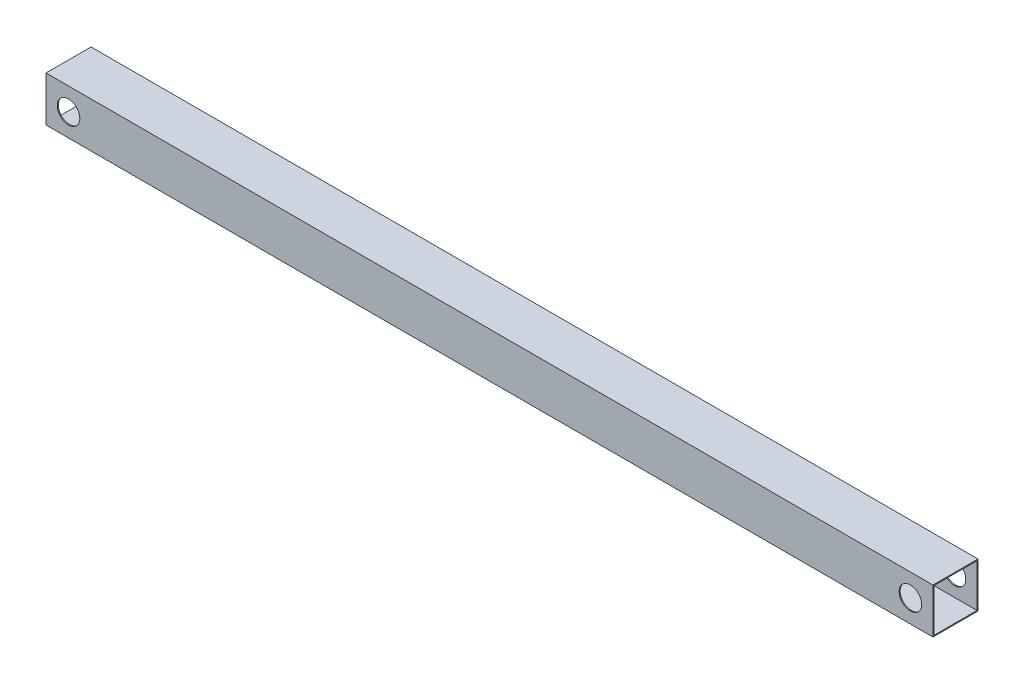
ISO-10303-21;
HEADER;
FILE_DESCRIPTION(('STEP AP214'),'2;1');
FILE_NAME('part.step','',(''),(''),'','','');
FILE_SCHEMA(('AUTOMOTIVE_DESIGN { 1 0 10303 214 1 1 1 1 }'));
ENDSEC;
DATA;
#1=APPLICATION_CONTEXT('core data for automotive mechanical design processes');
#2=APPLICATION_PROTOCOL_DEFINITION('international standard','automotive_design',2000,#1);
#3=PRODUCT_CONTEXT('',#1,'mechanical');
#4=PRODUCT('Part','Part','',(#3));
#5=PRODUCT_RELATED_PRODUCT_CATEGORY('part','',(#4));
#6=PRODUCT_DEFINITION_FORMATION('','',#4);
#7=PRODUCT_DEFINITION_CONTEXT('part definition',#1,'design');
#8=PRODUCT_DEFINITION('design','',#6,#7);
#9=PRODUCT_DEFINITION_SHAPE('','',#8);
#10=(LENGTH_UNIT() NAMED_UNIT(*) SI_UNIT(.MILLI.,.METRE.));
#11=(NAMED_UNIT(*) PLANE_ANGLE_UNIT() SI_UNIT($,.RADIAN.));
#12=(NAMED_UNIT(*) SI_UNIT($,.STERADIAN.) SOLID_ANGLE_UNIT());
#13=UNCERTAINTY_MEASURE_WITH_UNIT(LENGTH_MEASURE(1.E-05),#10,'distance_accuracy_value','');
#14=(GEOMETRIC_REPRESENTATION_CONTEXT(3) GLOBAL_UNCERTAINTY_ASSIGNED_CONTEXT((#13)) GLOBAL_UNIT_ASSIGNED_CONTEXT((#10,
#11,#12)) REPRESENTATION_CONTEXT('',''));
#15=CARTESIAN_POINT('',(0.,0.,0.));
#16=DIRECTION('',(0.,0.,1.));
#17=DIRECTION('',(1.,0.,0.));
#18=AXIS2_PLACEMENT_3D('',#15,#16,#17);
#19=CARTESIAN_POINT('',(500.,12.7,12.7));
#20=DIRECTION('',(0.,-1.,0.));
#21=DIRECTION('',(0.,0.,-1.));
#22=AXIS2_PLACEMENT_3D('',#19,#20,#21);
#23=PLANE('',#22);
#24=DIRECTION('',(0.,0.,1.));
#25=VECTOR('',#24,1.);
#26=CARTESIAN_POINT('',(0.,12.7,12.7));
#27=LINE('',#26,#25);
#28=CARTESIAN_POINT('',(0.,12.7,-12.7));
#29=VERTEX_POINT('',#28);
#30=CARTESIAN_POINT('',(0.,12.7,12.7));
#31=VERTEX_POINT('',#30);
#32=EDGE_CURVE('E159',#29,#31,#27,.T.);
#33=ORIENTED_EDGE('',*,*,#32,.T.);
#34=DIRECTION('',(-1.,0.,0.));
#35=VECTOR('',#34,1.);
#36=CARTESIAN_POINT('',(500.,12.7,12.7));
#37=LINE('',#36,#35);
#38=CARTESIAN_POINT('',(500.,12.7,12.7));
#39=VERTEX_POINT('',#38);
#40=EDGE_CURVE('E12',#39,#31,#37,.T.);
#41=ORIENTED_EDGE('',*,*,#40,.F.);
#42=DIRECTION('',(0.,0.,1.));
#43=VECTOR('',#42,1.);
#44=CARTESIAN_POINT('',(500.,12.7,12.7));
#45=LINE('',#44,#43);
#46=CARTESIAN_POINT('',(500.,12.7,-12.7));
#47=VERTEX_POINT('',#46);
#48=EDGE_CURVE('E132',#47,#39,#45,.T.);
#49=ORIENTED_EDGE('',*,*,#48,.F.);
#50=DIRECTION('',(-1.,0.,0.));
#51=VECTOR('',#50,1.);
#52=CARTESIAN_POINT('',(500.,12.7,-12.7));
#53=LINE('',#52,#51);
#54=EDGE_CURVE('E166',#47,#29,#53,.T.);
#55=ORIENTED_EDGE('',*,*,#54,.T.);
#56=EDGE_LOOP('',(#33,#41,#49,#55));
#57=FACE_BOUND('',#56,.T.);
#58=ADVANCED_FACE('F51',(#57),#23,.F.);
#59=CARTESIAN_POINT('',(500.,12.7,12.7));
#60=DIRECTION('',(0.,0.,-1.));
#61=DIRECTION('',(-1.,0.,0.));
#62=AXIS2_PLACEMENT_3D('',#59,#60,#61);
#63=PLANE('',#62);
#64=CARTESIAN_POINT('',(487.3,0.,12.7));
#65=DIRECTION('',(0.,0.,1.));
#66=DIRECTION('',(1.,0.,0.));
#67=AXIS2_PLACEMENT_3D('',#64,#65,#66);
#68=CIRCLE('',#67,6.34999999999982);
#69=CARTESIAN_POINT('',(493.65,0.,12.7));
#70=VERTEX_POINT('',#69);
#71=EDGE_CURVE('E217',#70,#70,#68,.T.);
#72=ORIENTED_EDGE('',*,*,#71,.F.);
#73=EDGE_LOOP('',(#72));
#74=FACE_BOUND('',#73,.T.);
#75=CARTESIAN_POINT('',(12.7,0.,12.7));
#76=DIRECTION('',(0.,0.,1.));
#77=DIRECTION('',(1.,0.,0.));
#78=AXIS2_PLACEMENT_3D('',#75,#76,#77);
#79=CIRCLE('',#78,6.35);
#80=CARTESIAN_POINT('',(19.05,0.,12.7));
#81=VERTEX_POINT('',#80);
#82=EDGE_CURVE('E205',#81,#81,#79,.T.);
#83=ORIENTED_EDGE('',*,*,#82,.F.);
#84=EDGE_LOOP('',(#83));
#85=FACE_BOUND('',#84,.T.);
#86=DIRECTION('',(0.,-1.,0.));
#87=VECTOR('',#86,1.);
#88=CARTESIAN_POINT('',(0.,12.7,12.7));
#89=LINE('',#88,#87);
#90=CARTESIAN_POINT('',(0.,-12.7,12.7));
#91=VERTEX_POINT('',#90);
#92=EDGE_CURVE('E137',#31,#91,#89,.T.);
#93=ORIENTED_EDGE('',*,*,#92,.T.);
#94=DIRECTION('',(-1.,0.,0.));
#95=VECTOR('',#94,1.);
#96=CARTESIAN_POINT('',(500.,-12.7,12.7));
#97=LINE('',#96,#95);
#98=CARTESIAN_POINT('',(500.,-12.7,12.7));
#99=VERTEX_POINT('',#98);
#100=EDGE_CURVE('E61',#99,#91,#97,.T.);
#101=ORIENTED_EDGE('',*,*,#100,.F.);
#102=DIRECTION('',(0.,-1.,0.));
#103=VECTOR('',#102,1.);
#104=CARTESIAN_POINT('',(500.,12.7,12.7));
#105=LINE('',#104,#103);
#106=EDGE_CURVE('E126',#39,#99,#105,.T.);
#107=ORIENTED_EDGE('',*,*,#106,.F.);
#108=ORIENTED_EDGE('',*,*,#40,.T.);
#109=EDGE_LOOP('',(#93,#101,#107,#108));
#110=FACE_BOUND('',#109,.T.);
#111=ADVANCED_FACE('F136',(#74,#85,#110),#63,.F.);
#112=CARTESIAN_POINT('',(500.,-12.7,-12.7));
#113=DIRECTION('',(0.,1.,0.));
#114=DIRECTION('',(0.,0.,1.));
#115=AXIS2_PLACEMENT_3D('',#112,#113,#114);
#116=PLANE('',#115);
#117=DIRECTION('',(0.,0.,-1.));
#118=VECTOR('',#117,1.);
#119=CARTESIAN_POINT('',(0.,-12.7,-12.7));
#120=LINE('',#119,#118);
#121=CARTESIAN_POINT('',(0.,-12.7,-12.7));
#122=VERTEX_POINT('',#121);
#123=EDGE_CURVE('E99',#91,#122,#120,.T.);
#124=ORIENTED_EDGE('',*,*,#123,.T.);
#125=DIRECTION('',(-1.,0.,0.));
#126=VECTOR('',#125,1.);
#127=CARTESIAN_POINT('',(500.,-12.7,-12.7));
#128=LINE('',#127,#126);
#129=CARTESIAN_POINT('',(500.,-12.7,-12.7));
#130=VERTEX_POINT('',#129);
#131=EDGE_CURVE('E138',#130,#122,#128,.T.);
#132=ORIENTED_EDGE('',*,*,#131,.F.);
#133=DIRECTION('',(0.,0.,-1.));
#134=VECTOR('',#133,1.);
#135=CARTESIAN_POINT('',(500.,-12.7,-12.7));
#136=LINE('',#135,#134);
#137=EDGE_CURVE('E130',#99,#130,#136,.T.);
#138=ORIENTED_EDGE('',*,*,#137,.F.);
#139=ORIENTED_EDGE('',*,*,#100,.T.);
#140=EDGE_LOOP('',(#124,#132,#138,#139));
#141=FACE_BOUND('',#140,.T.);
#142=ADVANCED_FACE('F140',(#141),#116,.F.);
#143=CARTESIAN_POINT('',(500.,12.1412,12.1412));
#144=DIRECTION('',(0.,0.,-1.));
#145=DIRECTION('',(-1.,0.,0.));
#146=AXIS2_PLACEMENT_3D('',#143,#144,#145);
#147=PLANE('',#146);
#148=CARTESIAN_POINT('',(487.3,0.,12.1412));
#149=DIRECTION('',(0.,0.,-1.));
#150=DIRECTION('',(-1.,0.,0.));
#151=AXIS2_PLACEMENT_3D('',#148,#149,#150);
#152=CIRCLE('',#151,6.34999999999982);
#153=CARTESIAN_POINT('',(480.95,0.,12.1412));
#154=VERTEX_POINT('',#153);
#155=EDGE_CURVE('E208',#154,#154,#152,.T.);
#156=ORIENTED_EDGE('',*,*,#155,.F.);
#157=EDGE_LOOP('',(#156));
#158=FACE_BOUND('',#157,.T.);
#159=CARTESIAN_POINT('',(12.7,0.,12.1412));
#160=DIRECTION('',(0.,0.,-1.));
#161=DIRECTION('',(-1.,0.,0.));
#162=AXIS2_PLACEMENT_3D('',#159,#160,#161);
#163=CIRCLE('',#162,6.35);
#164=CARTESIAN_POINT('',(6.35,0.,12.1412));
#165=VERTEX_POINT('',#164);
#166=EDGE_CURVE('E150',#165,#165,#163,.T.);
#167=ORIENTED_EDGE('',*,*,#166,.F.);
#168=EDGE_LOOP('',(#167));
#169=FACE_BOUND('',#168,.T.);
#170=DIRECTION('',(0.,-1.,0.));
#171=VECTOR('',#170,1.);
#172=CARTESIAN_POINT('',(0.,12.1412,12.1412));
#173=LINE('',#172,#171);
#174=CARTESIAN_POINT('',(0.,12.1412,12.1412));
#175=VERTEX_POINT('',#174);
#176=CARTESIAN_POINT('',(0.,-12.1412,12.1412));
#177=VERTEX_POINT('',#176);
#178=EDGE_CURVE('E146',#175,#177,#173,.T.);
#179=ORIENTED_EDGE('',*,*,#178,.F.);
#180=DIRECTION('',(-1.,0.,0.));
#181=VECTOR('',#180,1.);
#182=CARTESIAN_POINT('',(500.,12.1412,12.1412));
#183=LINE('',#182,#181);
#184=CARTESIAN_POINT('',(500.,12.1412,12.1412));
#185=VERTEX_POINT('',#184);
#186=EDGE_CURVE('E55',#185,#175,#183,.T.);
#187=ORIENTED_EDGE('',*,*,#186,.F.);
#188=DIRECTION('',(0.,-1.,0.));
#189=VECTOR('',#188,1.);
#190=CARTESIAN_POINT('',(500.,12.1412,12.1412));
#191=LINE('',#190,#189);
#192=CARTESIAN_POINT('',(500.,-12.1412,12.1412));
#193=VERTEX_POINT('',#192);
#194=EDGE_CURVE('E165',#185,#193,#191,.T.);
#195=ORIENTED_EDGE('',*,*,#194,.T.);
#196=DIRECTION('',(-1.,0.,0.));
#197=VECTOR('',#196,1.);
#198=CARTESIAN_POINT('',(500.,-12.1412,12.1412));
#199=LINE('',#198,#197);
#200=EDGE_CURVE('E142',#193,#177,#199,.T.);
#201=ORIENTED_EDGE('',*,*,#200,.T.);
#202=EDGE_LOOP('',(#179,#187,#195,#201));
#203=FACE_BOUND('',#202,.T.);
#204=ADVANCED_FACE('F53',(#158,#169,#203),#147,.T.);
#205=CARTESIAN_POINT('',(500.,12.1412,12.1412));
#206=DIRECTION('',(0.,-1.,0.));
#207=DIRECTION('',(0.,0.,-1.));
#208=AXIS2_PLACEMENT_3D('',#205,#206,#207);
#209=PLANE('',#208);
#210=DIRECTION('',(0.,0.,1.));
#211=VECTOR('',#210,1.);
#212=CARTESIAN_POINT('',(0.,12.1412,12.1412));
#213=LINE('',#212,#211);
#214=CARTESIAN_POINT('',(0.,12.1412,-12.1412));
#215=VERTEX_POINT('',#214);
#216=EDGE_CURVE('E149',#215,#175,#213,.T.);
#217=ORIENTED_EDGE('',*,*,#216,.F.);
#218=DIRECTION('',(-1.,0.,0.));
#219=VECTOR('',#218,1.);
#220=CARTESIAN_POINT('',(500.,12.1412,-12.1412));
#221=LINE('',#220,#219);
#222=CARTESIAN_POINT('',(500.,12.1412,-12.1412));
#223=VERTEX_POINT('',#222);
#224=EDGE_CURVE('E171',#223,#215,#221,.T.);
#225=ORIENTED_EDGE('',*,*,#224,.F.);
#226=DIRECTION('',(0.,0.,1.));
#227=VECTOR('',#226,1.);
#228=CARTESIAN_POINT('',(500.,12.1412,12.1412));
#229=LINE('',#228,#227);
#230=EDGE_CURVE('E180',#223,#185,#229,.T.);
#231=ORIENTED_EDGE('',*,*,#230,.T.);
#232=ORIENTED_EDGE('',*,*,#186,.T.);
#233=EDGE_LOOP('',(#217,#225,#231,#232));
#234=FACE_BOUND('',#233,.T.);
#235=ADVANCED_FACE('F178',(#234),#209,.T.);
#236=CARTESIAN_POINT('',(500.,-12.1412,-12.1412));
#237=DIRECTION('',(0.,0.,1.));
#238=DIRECTION('',(1.,0.,0.));
#239=AXIS2_PLACEMENT_3D('',#236,#237,#238);
#240=PLANE('',#239);
#241=CARTESIAN_POINT('',(487.3,0.,-12.1412));
#242=DIRECTION('',(0.,0.,1.));
#243=DIRECTION('',(1.,0.,0.));
#244=AXIS2_PLACEMENT_3D('',#241,#242,#243);
#245=CIRCLE('',#244,6.34999999999982);
#246=CARTESIAN_POINT('',(493.65,0.,-12.1412));
#247=VERTEX_POINT('',#246);
#248=EDGE_CURVE('E213',#247,#247,#245,.T.);
#249=ORIENTED_EDGE('',*,*,#248,.F.);
#250=EDGE_LOOP('',(#249));
#251=FACE_BOUND('',#250,.T.);
#252=CARTESIAN_POINT('',(12.7,0.,-12.1412));
#253=DIRECTION('',(0.,0.,1.));
#254=DIRECTION('',(1.,0.,0.));
#255=AXIS2_PLACEMENT_3D('',#252,#253,#254);
#256=CIRCLE('',#255,6.35);
#257=CARTESIAN_POINT('',(19.05,0.,-12.1412));
#258=VERTEX_POINT('',#257);
#259=EDGE_CURVE('E201',#258,#258,#256,.T.);
#260=ORIENTED_EDGE('',*,*,#259,.F.);
#261=EDGE_LOOP('',(#260));
#262=FACE_BOUND('',#261,.T.);
#263=DIRECTION('',(0.,1.,0.));
#264=VECTOR('',#263,1.);
#265=CARTESIAN_POINT('',(0.,-12.1412,-12.1412));
#266=LINE('',#265,#264);
#267=CARTESIAN_POINT('',(0.,-12.1412,-12.1412));
#268=VERTEX_POINT('',#267);
#269=EDGE_CURVE('E153',#268,#215,#266,.T.);
#270=ORIENTED_EDGE('',*,*,#269,.F.);
#271=DIRECTION('',(-1.,0.,0.));
#272=VECTOR('',#271,1.);
#273=CARTESIAN_POINT('',(500.,-12.1412,-12.1412));
#274=LINE('',#273,#272);
#275=CARTESIAN_POINT('',(500.,-12.1412,-12.1412));
#276=VERTEX_POINT('',#275);
#277=EDGE_CURVE('E170',#276,#268,#274,.T.);
#278=ORIENTED_EDGE('',*,*,#277,.F.);
#279=DIRECTION('',(0.,1.,0.));
#280=VECTOR('',#279,1.);
#281=CARTESIAN_POINT('',(500.,-12.1412,-12.1412));
#282=LINE('',#281,#280);
#283=EDGE_CURVE('E187',#276,#223,#282,.T.);
#284=ORIENTED_EDGE('',*,*,#283,.T.);
#285=ORIENTED_EDGE('',*,*,#224,.T.);
#286=EDGE_LOOP('',(#270,#278,#284,#285));
#287=FACE_BOUND('',#286,.T.);
#288=ADVANCED_FACE('F185',(#251,#262,#287),#240,.T.);
#289=CARTESIAN_POINT('',(500.,-12.1412,-12.1412));
#290=DIRECTION('',(0.,1.,0.));
#291=DIRECTION('',(0.,0.,1.));
#292=AXIS2_PLACEMENT_3D('',#289,#290,#291);
#293=PLANE('',#292);
#294=DIRECTION('',(0.,0.,-1.));
#295=VECTOR('',#294,1.);
#296=CARTESIAN_POINT('',(0.,-12.1412,-12.1412));
#297=LINE('',#296,#295);
#298=EDGE_CURVE('E156',#177,#268,#297,.T.);
#299=ORIENTED_EDGE('',*,*,#298,.F.);
#300=ORIENTED_EDGE('',*,*,#200,.F.);
#301=DIRECTION('',(0.,0.,-1.));
#302=VECTOR('',#301,1.);
#303=CARTESIAN_POINT('',(500.,-12.1412,-12.1412));
#304=LINE('',#303,#302);
#305=EDGE_CURVE('E192',#193,#276,#304,.T.);
#306=ORIENTED_EDGE('',*,*,#305,.T.);
#307=ORIENTED_EDGE('',*,*,#277,.T.);
#308=EDGE_LOOP('',(#299,#300,#306,#307));
#309=FACE_BOUND('',#308,.T.);
#310=ADVANCED_FACE('F194',(#309),#293,.T.);
#311=CARTESIAN_POINT('',(500.,-12.7,-12.7));
#312=DIRECTION('',(0.,0.,1.));
#313=DIRECTION('',(0.,-1.,0.));
#314=AXIS2_PLACEMENT_3D('',#311,#312,#313);
#315=PLANE('',#314);
#316=CARTESIAN_POINT('',(487.3,0.,-12.7));
#317=DIRECTION('',(0.,0.,1.));
#318=DIRECTION('',(1.,0.,0.));
#319=AXIS2_PLACEMENT_3D('',#316,#317,#318);
#320=CIRCLE('',#319,6.34999999999982);
#321=CARTESIAN_POINT('',(493.65,0.,-12.7));
#322=VERTEX_POINT('',#321);
#323=EDGE_CURVE('E216',#322,#322,#320,.T.);
#324=ORIENTED_EDGE('',*,*,#323,.T.);
#325=EDGE_LOOP('',(#324));
#326=FACE_BOUND('',#325,.T.);
#327=CARTESIAN_POINT('',(12.7,0.,-12.7));
#328=DIRECTION('',(0.,0.,1.));
#329=DIRECTION('',(1.,0.,0.));
#330=AXIS2_PLACEMENT_3D('',#327,#328,#329);
#331=CIRCLE('',#330,6.35);
#332=CARTESIAN_POINT('',(19.05,0.,-12.7));
#333=VERTEX_POINT('',#332);
#334=EDGE_CURVE('E204',#333,#333,#331,.T.);
#335=ORIENTED_EDGE('',*,*,#334,.T.);
#336=EDGE_LOOP('',(#335));
#337=FACE_BOUND('',#336,.T.);
#338=DIRECTION('',(0.,1.,0.));
#339=VECTOR('',#338,1.);
#340=CARTESIAN_POINT('',(0.,-12.7,-12.7));
#341=LINE('',#340,#339);
#342=EDGE_CURVE('E105',#122,#29,#341,.T.);
#343=ORIENTED_EDGE('',*,*,#342,.T.);
#344=ORIENTED_EDGE('',*,*,#54,.F.);
#345=DIRECTION('',(0.,1.,0.));
#346=VECTOR('',#345,1.);
#347=CARTESIAN_POINT('',(500.,-12.7,-12.7));
#348=LINE('',#347,#346);
#349=EDGE_CURVE('E70',#130,#47,#348,.T.);
#350=ORIENTED_EDGE('',*,*,#349,.F.);
#351=ORIENTED_EDGE('',*,*,#131,.T.);
#352=EDGE_LOOP('',(#343,#344,#350,#351));
#353=FACE_BOUND('',#352,.T.);
#354=ADVANCED_FACE('F223',(#326,#337,#353),#315,.F.);
#355=CARTESIAN_POINT('',(500.,0.,0.));
#356=DIRECTION('',(1.,0.,0.));
#357=DIRECTION('',(0.,0.,-1.));
#358=AXIS2_PLACEMENT_3D('',#355,#356,#357);
#359=PLANE('',#358);
#360=ORIENTED_EDGE('',*,*,#194,.F.);
#361=ORIENTED_EDGE('',*,*,#230,.F.);
#362=ORIENTED_EDGE('',*,*,#283,.F.);
#363=ORIENTED_EDGE('',*,*,#305,.F.);
#364=EDGE_LOOP('',(#360,#361,#362,#363));
#365=FACE_BOUND('',#364,.T.);
#366=ORIENTED_EDGE('',*,*,#48,.T.);
#367=ORIENTED_EDGE('',*,*,#106,.T.);
#368=ORIENTED_EDGE('',*,*,#137,.T.);
#369=ORIENTED_EDGE('',*,*,#349,.T.);
#370=EDGE_LOOP('',(#366,#367,#368,#369));
#371=FACE_BOUND('',#370,.T.);
#372=ADVANCED_FACE('F128',(#365,#371),#359,.T.);
#373=CARTESIAN_POINT('',(0.,0.,0.));
#374=DIRECTION('',(1.,0.,0.));
#375=DIRECTION('',(0.,0.,-1.));
#376=AXIS2_PLACEMENT_3D('',#373,#374,#375);
#377=PLANE('',#376);
#378=ORIENTED_EDGE('',*,*,#178,.T.);
#379=ORIENTED_EDGE('',*,*,#298,.T.);
#380=ORIENTED_EDGE('',*,*,#269,.T.);
#381=ORIENTED_EDGE('',*,*,#216,.T.);
#382=EDGE_LOOP('',(#378,#379,#380,#381));
#383=FACE_BOUND('',#382,.T.);
#384=ORIENTED_EDGE('',*,*,#32,.F.);
#385=ORIENTED_EDGE('',*,*,#342,.F.);
#386=ORIENTED_EDGE('',*,*,#123,.F.);
#387=ORIENTED_EDGE('',*,*,#92,.F.);
#388=EDGE_LOOP('',(#384,#385,#386,#387));
#389=FACE_BOUND('',#388,.T.);
#390=ADVANCED_FACE('F183',(#383,#389),#377,.F.);
#391=CARTESIAN_POINT('',(12.7,0.,-12.7));
#392=DIRECTION('',(0.,0.,1.));
#393=DIRECTION('',(1.,0.,0.));
#394=AXIS2_PLACEMENT_3D('',#391,#392,#393);
#395=CYLINDRICAL_SURFACE('',#394,6.35);
#396=ORIENTED_EDGE('',*,*,#259,.T.);
#397=EDGE_LOOP('',(#396));
#398=FACE_BOUND('',#397,.T.);
#399=ORIENTED_EDGE('',*,*,#334,.F.);
#400=EDGE_LOOP('',(#399));
#401=FACE_BOUND('',#400,.T.);
#402=ADVANCED_FACE('F237',(#398,#401),#395,.F.);
#403=ORIENTED_EDGE('',*,*,#166,.T.);
#404=EDGE_LOOP('',(#403));
#405=FACE_BOUND('',#404,.T.);
#406=ORIENTED_EDGE('',*,*,#82,.T.);
#407=EDGE_LOOP('',(#406));
#408=FACE_BOUND('',#407,.T.);
#409=ADVANCED_FACE('F229',(#405,#408),#395,.F.);
#410=CARTESIAN_POINT('',(487.3,0.,-12.7));
#411=DIRECTION('',(0.,0.,1.));
#412=DIRECTION('',(1.,0.,0.));
#413=AXIS2_PLACEMENT_3D('',#410,#411,#412);
#414=CYLINDRICAL_SURFACE('',#413,6.34999999999982);
#415=ORIENTED_EDGE('',*,*,#248,.T.);
#416=EDGE_LOOP('',(#415));
#417=FACE_BOUND('',#416,.T.);
#418=ORIENTED_EDGE('',*,*,#323,.F.);
#419=EDGE_LOOP('',(#418));
#420=FACE_BOUND('',#419,.T.);
#421=ADVANCED_FACE('F226',(#417,#420),#414,.F.);
#422=ORIENTED_EDGE('',*,*,#155,.T.);
#423=EDGE_LOOP('',(#422));
#424=FACE_BOUND('',#423,.T.);
#425=ORIENTED_EDGE('',*,*,#71,.T.);
#426=EDGE_LOOP('',(#425));
#427=FACE_BOUND('',#426,.T.);
#428=ADVANCED_FACE('F228',(#424,#427),#414,.F.);
#429=CLOSED_SHELL('',(#58,#111,#142,#204,#235,#288,#310,#354,#372,#390,#402,#409,#421,#428));
#430=MANIFOLD_SOLID_BREP('B2',#429);
#431=ADVANCED_BREP_SHAPE_REPRESENTATION('',(#18,#430),#14);
#432=SHAPE_DEFINITION_REPRESENTATION(#9,#431);
ENDSEC;
END-ISO-10303-21;
